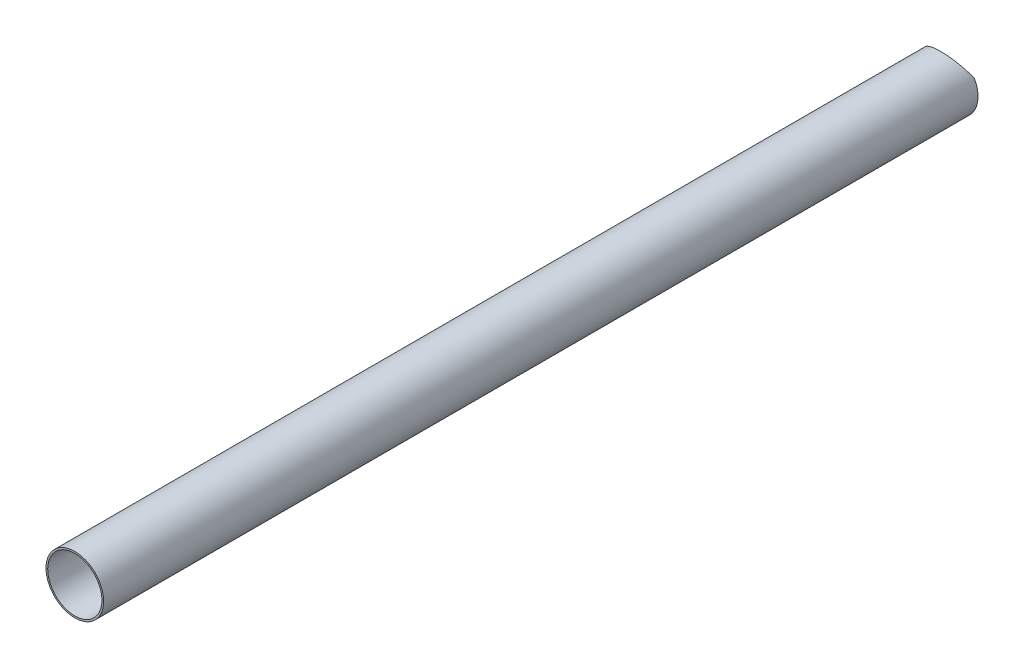
ISO-10303-21;
HEADER;
FILE_DESCRIPTION(('STEP AP214'),'2;1');
FILE_NAME('part.step','',(''),(''),'','','');
FILE_SCHEMA(('AUTOMOTIVE_DESIGN { 1 0 10303 214 1 1 1 1 }'));
ENDSEC;
DATA;
#1=APPLICATION_CONTEXT('core data for automotive mechanical design processes');
#2=APPLICATION_PROTOCOL_DEFINITION('international standard','automotive_design',2000,#1);
#3=PRODUCT_CONTEXT('',#1,'mechanical');
#4=PRODUCT('Part','Part','',(#3));
#5=PRODUCT_RELATED_PRODUCT_CATEGORY('part','',(#4));
#6=PRODUCT_DEFINITION_FORMATION('','',#4);
#7=PRODUCT_DEFINITION_CONTEXT('part definition',#1,'design');
#8=PRODUCT_DEFINITION('design','',#6,#7);
#9=PRODUCT_DEFINITION_SHAPE('','',#8);
#10=(LENGTH_UNIT() NAMED_UNIT(*) SI_UNIT(.MILLI.,.METRE.));
#11=(NAMED_UNIT(*) PLANE_ANGLE_UNIT() SI_UNIT($,.RADIAN.));
#12=(NAMED_UNIT(*) SI_UNIT($,.STERADIAN.) SOLID_ANGLE_UNIT());
#13=UNCERTAINTY_MEASURE_WITH_UNIT(LENGTH_MEASURE(1.E-05),#10,'distance_accuracy_value','');
#14=(GEOMETRIC_REPRESENTATION_CONTEXT(3) GLOBAL_UNCERTAINTY_ASSIGNED_CONTEXT((#13)) GLOBAL_UNIT_ASSIGNED_CONTEXT((#10,
#11,#12)) REPRESENTATION_CONTEXT('',''));
#15=CARTESIAN_POINT('',(0.,0.,0.));
#16=DIRECTION('',(0.,0.,1.));
#17=DIRECTION('',(1.,0.,0.));
#18=AXIS2_PLACEMENT_3D('',#15,#16,#17);
#19=CARTESIAN_POINT('',(0.,25.4,0.));
#20=DIRECTION('',(0.,0.,1.));
#21=DIRECTION('',(1.,0.,0.));
#22=AXIS2_PLACEMENT_3D('',#19,#20,#21);
#23=PLANE('',#22);
#24=CARTESIAN_POINT('',(0.,0.,0.));
#25=DIRECTION('',(0.,0.,-1.));
#26=DIRECTION('',(-1.,0.,0.));
#27=AXIS2_PLACEMENT_3D('',#24,#25,#26);
#28=CIRCLE('',#27,25.4);
#29=CARTESIAN_POINT('',(-25.4,0.,0.));
#30=VERTEX_POINT('',#29);
#31=EDGE_CURVE('E82',#30,#30,#28,.T.);
#32=ORIENTED_EDGE('',*,*,#31,.T.);
#33=EDGE_LOOP('',(#32));
#34=FACE_BOUND('',#33,.T.);
#35=CARTESIAN_POINT('',(0.,0.,0.));
#36=DIRECTION('',(0.,0.,-1.));
#37=DIRECTION('',(-1.,0.,0.));
#38=AXIS2_PLACEMENT_3D('',#35,#36,#37);
#39=CIRCLE('',#38,26.9875);
#40=CARTESIAN_POINT('',(-26.9875,0.,0.));
#41=VERTEX_POINT('',#40);
#42=EDGE_CURVE('E54',#41,#41,#39,.T.);
#43=ORIENTED_EDGE('',*,*,#42,.F.);
#44=EDGE_LOOP('',(#43));
#45=FACE_BOUND('',#44,.T.);
#46=ADVANCED_FACE('F47',(#34,#45),#23,.T.);
#47=CARTESIAN_POINT('',(0.,0.,0.));
#48=DIRECTION('',(0.,0.,-1.));
#49=DIRECTION('',(-1.,0.,0.));
#50=AXIS2_PLACEMENT_3D('',#47,#48,#49);
#51=CYLINDRICAL_SURFACE('',#50,26.9875);
#52=CARTESIAN_POINT('',(0.,0.,-826.793740389755));
#53=DIRECTION('',(0.,-0.499999999999998,0.86602540378444));
#54=DIRECTION('',(0.,-0.86602540378444,-0.499999999999998));
#55=AXIS2_PLACEMENT_3D('',#52,#53,#54);
#56=ELLIPSE('',#55,31.16248077951,26.9875);
#57=CARTESIAN_POINT('',(-23.5169057235872,13.2393467149219,-819.15));
#58=VERTEX_POINT('',#57);
#59=CARTESIAN_POINT('',(23.5169057235872,13.2393467149219,-819.15));
#60=VERTEX_POINT('',#59);
#61=EDGE_CURVE('E65',#58,#60,#56,.F.);
#62=ORIENTED_EDGE('',*,*,#61,.F.);
#63=CARTESIAN_POINT('',(0.,0.,-819.15));
#64=DIRECTION('',(0.,0.,-1.));
#65=DIRECTION('',(-1.,0.,0.));
#66=AXIS2_PLACEMENT_3D('',#63,#64,#65);
#67=CIRCLE('',#66,26.9875);
#68=EDGE_CURVE('E81',#60,#58,#67,.T.);
#69=ORIENTED_EDGE('',*,*,#68,.F.);
#70=EDGE_LOOP('',(#62,#69));
#71=FACE_BOUND('',#70,.T.);
#72=ORIENTED_EDGE('',*,*,#42,.T.);
#73=EDGE_LOOP('',(#72));
#74=FACE_BOUND('',#73,.T.);
#75=ADVANCED_FACE('F79',(#71,#74),#51,.T.);
#76=CARTESIAN_POINT('',(0.,25.4,-819.15));
#77=DIRECTION('',(0.,0.,-1.));
#78=DIRECTION('',(-1.,0.,0.));
#79=AXIS2_PLACEMENT_3D('',#76,#77,#78);
#80=PLANE('',#79);
#81=DIRECTION('',(1.,0.,0.));
#82=VECTOR('',#81,1.);
#83=CARTESIAN_POINT('',(-26.9875,13.2393467149219,-819.15));
#84=LINE('',#83,#82);
#85=CARTESIAN_POINT('',(21.6767086653414,13.2393467149219,-819.15));
#86=VERTEX_POINT('',#85);
#87=EDGE_CURVE('E60',#86,#60,#84,.T.);
#88=ORIENTED_EDGE('',*,*,#87,.T.);
#89=ORIENTED_EDGE('',*,*,#68,.T.);
#90=CARTESIAN_POINT('',(-21.6767086653414,13.2393467149219,-819.15));
#91=VERTEX_POINT('',#90);
#92=EDGE_CURVE('E70',#58,#91,#84,.T.);
#93=ORIENTED_EDGE('',*,*,#92,.T.);
#94=CARTESIAN_POINT('',(0.,0.,-819.15));
#95=DIRECTION('',(0.,0.,-1.));
#96=DIRECTION('',(-1.,0.,0.));
#97=AXIS2_PLACEMENT_3D('',#94,#95,#96);
#98=CIRCLE('',#97,25.4);
#99=EDGE_CURVE('E85',#86,#91,#98,.T.);
#100=ORIENTED_EDGE('',*,*,#99,.F.);
#101=EDGE_LOOP('',(#88,#89,#93,#100));
#102=FACE_BOUND('',#101,.T.);
#103=ADVANCED_FACE('F84',(#102),#80,.T.);
#104=CARTESIAN_POINT('',(0.,0.,0.));
#105=DIRECTION('',(0.,0.,-1.));
#106=DIRECTION('',(-1.,0.,0.));
#107=AXIS2_PLACEMENT_3D('',#104,#105,#106);
#108=CYLINDRICAL_SURFACE('',#107,25.4);
#109=CARTESIAN_POINT('',(0.,0.,-826.793740389755));
#110=DIRECTION('',(0.,-0.499999999999998,0.86602540378444));
#111=DIRECTION('',(0.,-0.86602540378444,-0.499999999999998));
#112=AXIS2_PLACEMENT_3D('',#109,#110,#111);
#113=ELLIPSE('',#112,29.3293936748329,25.4);
#114=EDGE_CURVE('E13',#86,#91,#113,.T.);
#115=ORIENTED_EDGE('',*,*,#114,.F.);
#116=ORIENTED_EDGE('',*,*,#99,.T.);
#117=EDGE_LOOP('',(#115,#116));
#118=FACE_BOUND('',#117,.T.);
#119=ORIENTED_EDGE('',*,*,#31,.F.);
#120=EDGE_LOOP('',(#119));
#121=FACE_BOUND('',#120,.T.);
#122=ADVANCED_FACE('F95',(#118,#121),#108,.F.);
#123=CARTESIAN_POINT('',(-26.9875,13.2393467149219,-819.15));
#124=DIRECTION('',(0.,-0.499999999999998,0.86602540378444));
#125=DIRECTION('',(0.,-0.86602540378444,-0.499999999999998));
#126=AXIS2_PLACEMENT_3D('',#123,#124,#125);
#127=PLANE('',#126);
#128=ORIENTED_EDGE('',*,*,#61,.T.);
#129=ORIENTED_EDGE('',*,*,#87,.F.);
#130=ORIENTED_EDGE('',*,*,#114,.T.);
#131=ORIENTED_EDGE('',*,*,#92,.F.);
#132=EDGE_LOOP('',(#128,#129,#130,#131));
#133=FACE_BOUND('',#132,.T.);
#134=ADVANCED_FACE('F71',(#133),#127,.F.);
#135=CLOSED_SHELL('',(#46,#75,#103,#122,#134));
#136=MANIFOLD_SOLID_BREP('B2',#135);
#137=ADVANCED_BREP_SHAPE_REPRESENTATION('',(#18,#136),#14);
#138=SHAPE_DEFINITION_REPRESENTATION(#9,#137);
ENDSEC;
END-ISO-10303-21;
